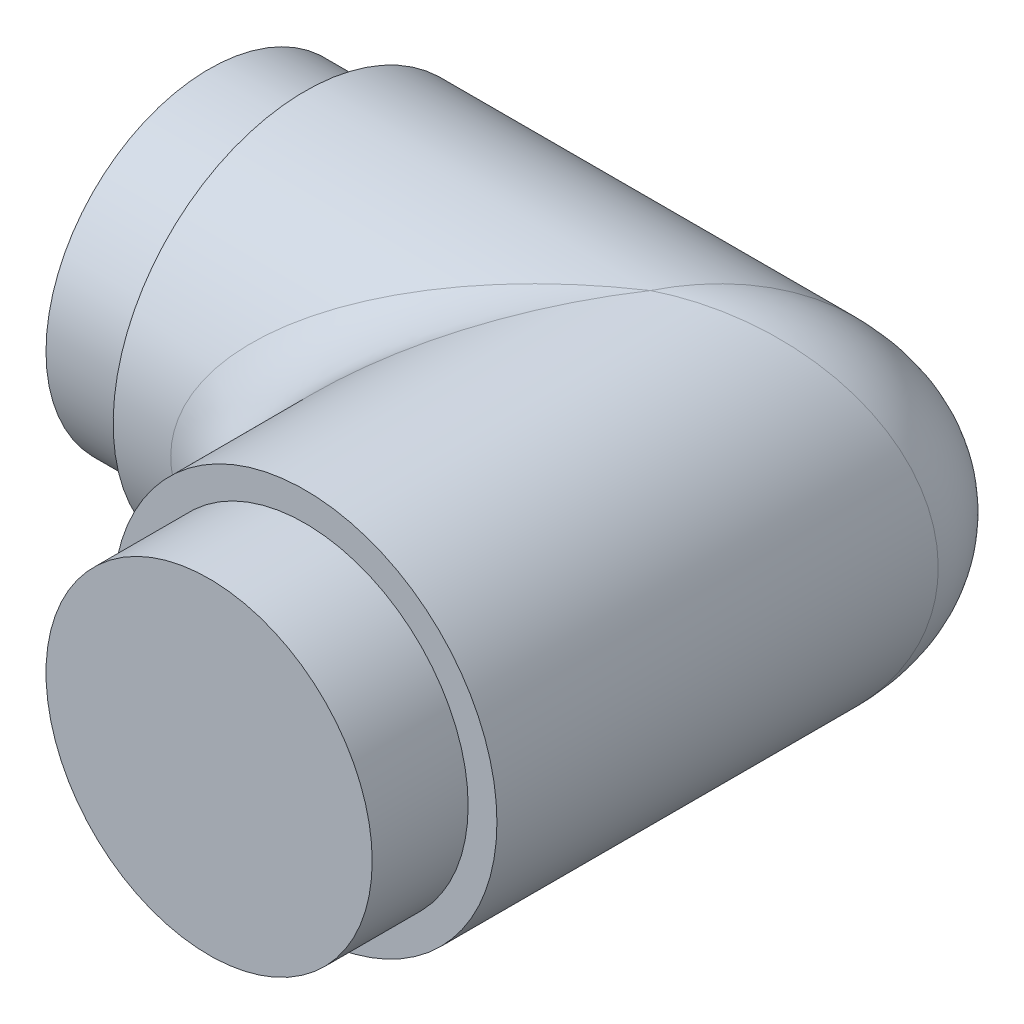
ISO-10303-21;
HEADER;
FILE_DESCRIPTION(('STEP AP214'),'2;1');
FILE_NAME('part.step','',(''),(''),'','','');
FILE_SCHEMA(('AUTOMOTIVE_DESIGN { 1 0 10303 214 1 1 1 1 }'));
ENDSEC;
DATA;
#1=APPLICATION_CONTEXT('core data for automotive mechanical design processes');
#2=APPLICATION_PROTOCOL_DEFINITION('international standard','automotive_design',2000,#1);
#3=PRODUCT_CONTEXT('',#1,'mechanical');
#4=PRODUCT('Part','Part','',(#3));
#5=PRODUCT_RELATED_PRODUCT_CATEGORY('part','',(#4));
#6=PRODUCT_DEFINITION_FORMATION('','',#4);
#7=PRODUCT_DEFINITION_CONTEXT('part definition',#1,'design');
#8=PRODUCT_DEFINITION('design','',#6,#7);
#9=PRODUCT_DEFINITION_SHAPE('','',#8);
#10=(LENGTH_UNIT() NAMED_UNIT(*) SI_UNIT(.MILLI.,.METRE.));
#11=(NAMED_UNIT(*) PLANE_ANGLE_UNIT() SI_UNIT($,.RADIAN.));
#12=(NAMED_UNIT(*) SI_UNIT($,.STERADIAN.) SOLID_ANGLE_UNIT());
#13=UNCERTAINTY_MEASURE_WITH_UNIT(LENGTH_MEASURE(1.E-05),#10,'distance_accuracy_value','');
#14=(GEOMETRIC_REPRESENTATION_CONTEXT(3) GLOBAL_UNCERTAINTY_ASSIGNED_CONTEXT((#13)) GLOBAL_UNIT_ASSIGNED_CONTEXT((#10,
#11,#12)) REPRESENTATION_CONTEXT('',''));
#15=CARTESIAN_POINT('',(0.,0.,0.));
#16=DIRECTION('',(0.,0.,1.));
#17=DIRECTION('',(1.,0.,0.));
#18=AXIS2_PLACEMENT_3D('',#15,#16,#17);
#19=CARTESIAN_POINT('',(-36.,0.,-36.));
#20=DIRECTION('',(1.,0.,0.));
#21=DIRECTION('',(0.,0.,-1.));
#22=AXIS2_PLACEMENT_3D('',#19,#20,#21);
#23=PLANE('',#22);
#24=CARTESIAN_POINT('',(-36.,0.,-36.));
#25=DIRECTION('',(-1.,0.,0.));
#26=DIRECTION('',(0.,0.,1.));
#27=AXIS2_PLACEMENT_3D('',#24,#25,#26);
#28=CIRCLE('',#27,17.);
#29=CARTESIAN_POINT('',(-36.,0.,-19.));
#30=VERTEX_POINT('',#29);
#31=EDGE_CURVE('E11',#30,#30,#28,.T.);
#32=ORIENTED_EDGE('',*,*,#31,.F.);
#33=EDGE_LOOP('',(#32));
#34=FACE_BOUND('',#33,.T.);
#35=CARTESIAN_POINT('',(-36.,0.,-36.));
#36=DIRECTION('',(1.,0.,0.));
#37=DIRECTION('',(0.,0.,-1.));
#38=AXIS2_PLACEMENT_3D('',#35,#36,#37);
#39=CIRCLE('',#38,20.);
#40=CARTESIAN_POINT('',(-36.,0.,-56.));
#41=VERTEX_POINT('',#40);
#42=EDGE_CURVE('E112',#41,#41,#39,.T.);
#43=ORIENTED_EDGE('',*,*,#42,.F.);
#44=EDGE_LOOP('',(#43));
#45=FACE_BOUND('',#44,.T.);
#46=ADVANCED_FACE('F35',(#34,#45),#23,.F.);
#47=CARTESIAN_POINT('',(0.,0.,0.));
#48=DIRECTION('',(0.,0.,1.));
#49=DIRECTION('',(1.,0.,0.));
#50=AXIS2_PLACEMENT_3D('',#47,#48,#49);
#51=PLANE('',#50);
#52=CARTESIAN_POINT('',(0.,0.,0.));
#53=DIRECTION('',(0.,0.,1.));
#54=DIRECTION('',(1.,0.,0.));
#55=AXIS2_PLACEMENT_3D('',#52,#53,#54);
#56=CIRCLE('',#55,17.);
#57=CARTESIAN_POINT('',(17.,0.,0.));
#58=VERTEX_POINT('',#57);
#59=EDGE_CURVE('E48',#58,#58,#56,.T.);
#60=ORIENTED_EDGE('',*,*,#59,.F.);
#61=EDGE_LOOP('',(#60));
#62=FACE_BOUND('',#61,.T.);
#63=CARTESIAN_POINT('',(0.,0.,0.));
#64=DIRECTION('',(0.,0.,1.));
#65=DIRECTION('',(1.,0.,0.));
#66=AXIS2_PLACEMENT_3D('',#63,#64,#65);
#67=CIRCLE('',#66,20.);
#68=CARTESIAN_POINT('',(20.,0.,0.));
#69=VERTEX_POINT('',#68);
#70=EDGE_CURVE('E72',#69,#69,#67,.T.);
#71=ORIENTED_EDGE('',*,*,#70,.T.);
#72=EDGE_LOOP('',(#71));
#73=FACE_BOUND('',#72,.T.);
#74=ADVANCED_FACE('F122',(#62,#73),#51,.T.);
#75=CARTESIAN_POINT('',(22.1,0.,-36.));
#76=DIRECTION('',(-1.,0.,0.));
#77=DIRECTION('',(0.,0.,1.));
#78=AXIS2_PLACEMENT_3D('',#75,#76,#77);
#79=CYLINDRICAL_SURFACE('',#78,20.);
#80=CARTESIAN_POINT('',(0.,0.,-36.));
#81=DIRECTION('',(0.894427190999916,0.,0.447213595499958));
#82=DIRECTION('',(-0.447213595499958,0.,0.894427190999916));
#83=AXIS2_PLACEMENT_3D('',#80,#81,#82);
#84=ELLIPSE('',#83,22.3606797749979,20.);
#85=CARTESIAN_POINT('',(0.,20.,-36.));
#86=VERTEX_POINT('',#85);
#87=CARTESIAN_POINT('',(0.,-20.,-36.));
#88=VERTEX_POINT('',#87);
#89=EDGE_CURVE('E62',#86,#88,#84,.F.);
#90=ORIENTED_EDGE('',*,*,#89,.T.);
#91=CARTESIAN_POINT('',(0.,0.,-36.));
#92=DIRECTION('',(0.554700196225229,0.,0.832050294337843));
#93=DIRECTION('',(-0.832050294337844,0.,0.554700196225229));
#94=AXIS2_PLACEMENT_3D('',#91,#92,#93);
#95=ELLIPSE('',#94,36.0555127546399,20.);
#96=EDGE_CURVE('E67',#88,#86,#95,.F.);
#97=ORIENTED_EDGE('',*,*,#96,.T.);
#98=EDGE_LOOP('',(#90,#97));
#99=FACE_BOUND('',#98,.T.);
#100=ORIENTED_EDGE('',*,*,#42,.T.);
#101=EDGE_LOOP('',(#100));
#102=FACE_BOUND('',#101,.T.);
#103=ADVANCED_FACE('F70',(#99,#102),#79,.T.);
#104=CARTESIAN_POINT('',(0.,0.,0.));
#105=DIRECTION('',(0.,0.,-1.));
#106=DIRECTION('',(-1.,0.,0.));
#107=AXIS2_PLACEMENT_3D('',#104,#105,#106);
#108=CYLINDRICAL_SURFACE('',#107,20.);
#109=ORIENTED_EDGE('',*,*,#70,.F.);
#110=EDGE_LOOP('',(#109));
#111=FACE_BOUND('',#110,.T.);
#112=CARTESIAN_POINT('',(0.,0.,-36.));
#113=DIRECTION('',(0.832050294337843,0.,0.554700196225229));
#114=DIRECTION('',(-0.554700196225229,0.,0.832050294337844));
#115=AXIS2_PLACEMENT_3D('',#112,#113,#114);
#116=ELLIPSE('',#115,36.0555127546399,20.);
#117=EDGE_CURVE('E55',#86,#88,#116,.T.);
#118=ORIENTED_EDGE('',*,*,#117,.T.);
#119=CARTESIAN_POINT('',(0.,0.,-36.));
#120=DIRECTION('',(0.447213595499958,0.,0.894427190999916));
#121=DIRECTION('',(-0.894427190999916,0.,0.447213595499958));
#122=AXIS2_PLACEMENT_3D('',#119,#120,#121);
#123=ELLIPSE('',#122,22.3606797749979,20.);
#124=EDGE_CURVE('E60',#88,#86,#123,.T.);
#125=ORIENTED_EDGE('',*,*,#124,.T.);
#126=EDGE_LOOP('',(#118,#125));
#127=FACE_BOUND('',#126,.T.);
#128=ADVANCED_FACE('F66',(#111,#127),#108,.T.);
#129=CARTESIAN_POINT('',(0.,-20.,-36.));
#130=CARTESIAN_POINT('',(0.,-20.,-36.));
#131=CARTESIAN_POINT('',(0.,-20.,-36.));
#132=CARTESIAN_POINT('',(-0.653537407305081,-19.9999773718841,-35.56430839513));
#133=CARTESIAN_POINT('',(-0.544619600287355,-20.0000955009884,-35.4553803997127));
#134=CARTESIAN_POINT('',(-0.435691604869956,-19.9999773718841,-35.3464625926949));
#135=CARTESIAN_POINT('',(-1.30707757604467,-19.9857617711192,-35.1286149493036));
#136=CARTESIAN_POINT('',(-1.08961987010995,-19.9786387208549,-34.9103801298901));
#137=CARTESIAN_POINT('',(-0.871385050696371,-19.9857617711192,-34.6929224239553));
#138=CARTESIAN_POINT('',(-2.61280923014607,-19.9287829881958,-34.2581271799026));
#139=CARTESIAN_POINT('',(-2.17632947258684,-19.8931632573161,-33.8236705274132));
#140=CARTESIAN_POINT('',(-1.74187282009737,-19.9287829881958,-33.3871907698539));
#141=CARTESIAN_POINT('',(-3.26500059844789,-19.886017424601,-33.823332934368));
#142=CARTESIAN_POINT('',(-2.71880862854572,-19.8290193154072,-33.2811913714543));
#143=CARTESIAN_POINT('',(-2.17666706563197,-19.886017424601,-32.7349994015521));
#144=CARTESIAN_POINT('',(-4.5610256459674,-19.7722637470195,-32.9593162360218));
#145=CARTESIAN_POINT('',(-3.79321706520929,-19.6588965795598,-32.2067829347907));
#146=CARTESIAN_POINT('',(-3.04068376397822,-19.7722637470195,-31.4389743540326));
#147=CARTESIAN_POINT('',(-5.20488318732619,-19.7015192201858,-32.530077875116));
#148=CARTESIAN_POINT('',(-4.32594777614854,-19.5530381385259,-31.6740522238515));
#149=CARTESIAN_POINT('',(-3.46992212488395,-19.7015192201858,-30.7951168126738));
#150=CARTESIAN_POINT('',(-6.488276663152,-19.5315168178226,-31.6744822245655));
#151=CARTESIAN_POINT('',(-5.38287178911451,-19.2997253684728,-30.6171282108855));
#152=CARTESIAN_POINT('',(-4.32551777543447,-19.5315168178226,-29.511723336848));
#153=CARTESIAN_POINT('',(-7.12781269379289,-19.4322595789879,-31.2481248708048));
#154=CARTESIAN_POINT('',(-5.90777086529949,-19.1519165725116,-30.0922291347005));
#155=CARTESIAN_POINT('',(-4.75187512919519,-19.4322595789879,-28.8721873062071));
#156=CARTESIAN_POINT('',(-9.01639353009967,-19.0949057834528,-29.9890709799334));
#157=CARTESIAN_POINT('',(-7.45233483334029,-18.6504370155069,-28.5476651666597));
#158=CARTESIAN_POINT('',(-6.0109290200666,-19.0949057834528,-26.9836064699003));
#159=CARTESIAN_POINT('',(-10.2574815112588,-18.8153091650284,-29.161678992494));
#160=CARTESIAN_POINT('',(-8.45566627181197,-18.2357073054076,-27.544333728188));
#161=CARTESIAN_POINT('',(-6.83832100750598,-18.8153091650284,-25.7425184887412));
#162=CARTESIAN_POINT('',(-12.6733960383033,-18.1481916263322,-27.5510693077979));
#163=CARTESIAN_POINT('',(-10.3681981398418,-17.2636289238417,-25.6318018601581));
#164=CARTESIAN_POINT('',(-8.44893069220206,-18.1481916263322,-23.3266039616967));
#165=CARTESIAN_POINT('',(-13.8491017360705,-17.7634990299673,-26.7672655092867));
#166=CARTESIAN_POINT('',(-11.2832995131976,-16.7048543488466,-24.7167004868023));
#167=CARTESIAN_POINT('',(-9.2327344907133,-17.7634990299673,-22.1508982639295));
#168=CARTESIAN_POINT('',(-16.114265096962,-16.8916175524403,-25.2571566020249));
#169=CARTESIAN_POINT('',(-12.9932023530867,-15.4684647846325,-23.0067976469133));
#170=CARTESIAN_POINT('',(-10.7428433979751,-16.8916175524403,-19.8857349030379));
#171=CARTESIAN_POINT('',(-17.2052768708399,-16.4080808872042,-24.5298154194387));
#172=CARTESIAN_POINT('',(-13.7935550156403,-14.789032809453,-22.2064449843596));
#173=CARTESIAN_POINT('',(-11.4701845805613,-16.4080808872042,-18.7947231291601));
#174=CARTESIAN_POINT('',(-18.7717447687386,-15.606730246908,-23.4855034875083));
#175=CARTESIAN_POINT('',(-14.886500507668,-13.706290360695,-21.113499492332));
#176=CARTESIAN_POINT('',(-12.5144965124917,-15.606730246908,-17.2282552312614));
#177=CARTESIAN_POINT('',(-19.2729021484031,-15.3330845349561,-23.1513985677331));
#178=CARTESIAN_POINT('',(-15.23069139662,-13.338025024348,-20.76930860338));
#179=CARTESIAN_POINT('',(-12.8486014322669,-15.3330845349561,-16.7270978515969));
#180=CARTESIAN_POINT('',(-20.2572013011531,-14.7584123910426,-22.4951991325665));
#181=CARTESIAN_POINT('',(-15.8893754261638,-12.5776764494615,-20.1106245738362));
#182=CARTESIAN_POINT('',(-13.5048008674334,-14.7584123910426,-15.7427986988469));
#183=CARTESIAN_POINT('',(-20.7403421396597,-14.457384541455,-22.1731052402277));
#184=CARTESIAN_POINT('',(-16.2037211792948,-12.1849468758514,-19.7962788207051));
#185=CARTESIAN_POINT('',(-13.8268947597722,-14.457384541455,-15.2596578603403));
#186=CARTESIAN_POINT('',(-22.1182170964308,-13.5387777689962,-21.2545219357111));
#187=CARTESIAN_POINT('',(-17.077019299719,-11.003056666434,-18.922980700281));
#188=CARTESIAN_POINT('',(-14.7454780642888,-13.5387777689962,-13.8817829035692));
#189=CARTESIAN_POINT('',(-22.9855762886943,-12.8833274442366,-20.6762824742014));
#190=CARTESIAN_POINT('',(-17.5839966386471,-10.1917707040173,-18.4160033613529));
#191=CARTESIAN_POINT('',(-15.3237175257986,-12.8833274442366,-13.0144237113057));
#192=CARTESIAN_POINT('',(-24.1900266706173,-11.836891963896,-19.8733155529229));
#193=CARTESIAN_POINT('',(-18.2215819851318,-8.98251628311905,-17.7784180148682));
#194=CARTESIAN_POINT('',(-16.1266844470771,-11.836891963896,-11.8099733293826));
#195=CARTESIAN_POINT('',(-24.5675048716504,-11.4865355671881,-19.6216634189027));
#196=CARTESIAN_POINT('',(-18.4122643609386,-8.58494781495033,-17.5877356390614));
#197=CARTESIAN_POINT('',(-16.3783365810973,-11.4865355671881,-11.4324951283496));
#198=CARTESIAN_POINT('',(-25.2954228650667,-10.7614449903105,-19.1363847566237));
#199=CARTESIAN_POINT('',(-18.7593462186233,-7.78937698727998,-17.2406537813767));
#200=CARTESIAN_POINT('',(-16.8636152433763,-10.7614449903105,-10.7045771349332));
#201=CARTESIAN_POINT('',(-25.6458609848502,-10.3867093047661,-18.9027593434315));
#202=CARTESIAN_POINT('',(-18.9151869433859,-7.39141442488322,-17.0848130566141));
#203=CARTESIAN_POINT('',(-17.0972406565685,-10.3867093047661,-10.3541390151498));
#204=CARTESIAN_POINT('',(-26.3009735469405,-9.63025284125466,-18.4660176353746));
#205=CARTESIAN_POINT('',(-19.1859072414716,-6.62004998263711,-16.8140927585284));
#206=CARTESIAN_POINT('',(-17.5339823646254,-9.63025284125466,-9.69902645305947));
#207=CARTESIAN_POINT('',(-26.606981088266,-9.24955941922355,-18.2620126078303));
#208=CARTESIAN_POINT('',(-19.3018233823111,-6.24635398283334,-16.6981766176889));
#209=CARTESIAN_POINT('',(-17.7379873921697,-9.24955941922355,-9.39301891173396));
#210=CARTESIAN_POINT('',(-27.1867791985308,-8.46711639645048,-17.8754805343203));
#211=CARTESIAN_POINT('',(-19.5029046512452,-5.51224033756709,-16.4970953487547));
#212=CARTESIAN_POINT('',(-18.1245194656797,-8.46711639645048,-8.8132208014692));
#213=CARTESIAN_POINT('',(-27.4605840336142,-8.06537623452368,-17.6929439775918));
#214=CARTESIAN_POINT('',(-19.5875499962666,-5.15231091872614,-16.4124500037334));
#215=CARTESIAN_POINT('',(-18.3070560224082,-8.06537623452369,-8.53941596638581));
#216=CARTESIAN_POINT('',(-27.962209749421,-7.25802070097671,-17.3585268337181));
#217=CARTESIAN_POINT('',(-19.7261277201694,-4.46574375605141,-16.2738722798305));
#218=CARTESIAN_POINT('',(-18.6414731662819,-7.25802070097671,-8.03779025057902));
#219=CARTESIAN_POINT('',(-28.1914077293382,-6.85316776976346,-17.2057281804433));
#220=CARTESIAN_POINT('',(-19.7807305467133,-4.1388308799805,-16.2192694532867));
#221=CARTESIAN_POINT('',(-18.7942718195567,-6.85316776976346,-7.80859227066178));
#222=CARTESIAN_POINT('',(-28.6130221347867,-6.02673471134899,-16.9246519101449));
#223=CARTESIAN_POINT('',(-19.8681955506459,-3.50728084108286,-16.1318044493541));
#224=CARTESIAN_POINT('',(-19.0753480898551,-6.02673471134899,-7.38697786521331));
#225=CARTESIAN_POINT('',(-28.8054405641676,-5.60515549695312,-16.7963729572214));
#226=CARTESIAN_POINT('',(-19.9007223528833,-3.2034297548191,-16.0992776471167));
#227=CARTESIAN_POINT('',(-19.2036270427786,-5.60515549695312,-7.19455943583244));
#228=CARTESIAN_POINT('',(-29.1449617876775,-4.76041281458725,-16.5700254748818));
#229=CARTESIAN_POINT('',(-19.9486789739317,-2.62868507619281,-16.0513210260683));
#230=CARTESIAN_POINT('',(-19.4299745251182,-4.76041281458725,-6.85503821232245));
#231=CARTESIAN_POINT('',(-29.2932464027904,-4.33767274658362,-16.4711690648097));
#232=CARTESIAN_POINT('',(-19.9643907766892,-2.35779435351466,-16.0356092233108));
#233=CARTESIAN_POINT('',(-19.5288309351903,-4.33767274658362,-6.70675359720958));
#234=CARTESIAN_POINT('',(-29.549257872628,-3.48138347973537,-16.3004947515849));
#235=CARTESIAN_POINT('',(-19.9859253927544,-1.83741425520838,-16.0140746072456));
#236=CARTESIAN_POINT('',(-19.6995052484151,-3.48138347973537,-6.45074212737195));
#237=CARTESIAN_POINT('',(-29.6569865448623,-3.0478347662075,-16.2286756367592));
#238=CARTESIAN_POINT('',(-19.9916428179296,-1.58871449621811,-16.0083571820704));
#239=CARTESIAN_POINT('',(-19.7713243632408,-3.0478347662075,-6.34301345513767));
#240=CARTESIAN_POINT('',(-29.8282967068132,-2.18034501117055,-16.1144688621238));
#241=CARTESIAN_POINT('',(-19.9982830029063,-1.11186402750622,-16.0017169970937));
#242=CARTESIAN_POINT('',(-19.8855311378762,-2.18034501117055,-6.17170329318681));
#243=CARTESIAN_POINT('',(-29.8925695374654,-1.74652568442777,-16.0716203083569));
#244=CARTESIAN_POINT('',(-19.99924835984,-0.884135657345921,-16.00075164016));
#245=CARTESIAN_POINT('',(-19.9283796916431,-1.74652568442777,-6.10743046253455));
#246=CARTESIAN_POINT('',(-29.97842080437,-0.875137527237295,-16.0143861304209));
#247=CARTESIAN_POINT('',(-20.0001089790586,-0.43727438010679,-15.9998910209414));
#248=CARTESIAN_POINT('',(-19.9856138695791,-0.875137527237295,-6.02157919563003));
#249=CARTESIAN_POINT('',(-30.,-0.437568763618647,-16.));
#250=CARTESIAN_POINT('',(-20.,-0.218794797614534,-16.));
#251=CARTESIAN_POINT('',(-20.,-0.437568763618647,-5.99999999999999));
#252=CARTESIAN_POINT('',(-30.,0.437568763618647,-16.));
#253=CARTESIAN_POINT('',(-20.,0.218794797614534,-16.));
#254=CARTESIAN_POINT('',(-20.,0.437568763618647,-5.99999999999999));
#255=CARTESIAN_POINT('',(-29.97842080437,0.875137527237294,-16.0143861304209));
#256=CARTESIAN_POINT('',(-20.0001089790586,0.437274380106789,-15.9998910209414));
#257=CARTESIAN_POINT('',(-19.9856138695791,0.875137527237295,-6.02157919563003));
#258=CARTESIAN_POINT('',(-29.8925695374654,1.74652568442777,-16.0716203083569));
#259=CARTESIAN_POINT('',(-19.99924835984,0.88413565734592,-16.00075164016));
#260=CARTESIAN_POINT('',(-19.9283796916431,1.74652568442777,-6.10743046253455));
#261=CARTESIAN_POINT('',(-29.8282967068132,2.18034501117055,-16.1144688621238));
#262=CARTESIAN_POINT('',(-19.9982830029063,1.11186402750622,-16.0017169970937));
#263=CARTESIAN_POINT('',(-19.8855311378762,2.18034501117055,-6.17170329318681));
#264=CARTESIAN_POINT('',(-29.6569865448623,3.0478347662075,-16.2286756367592));
#265=CARTESIAN_POINT('',(-19.9916428179296,1.58871449621811,-16.0083571820704));
#266=CARTESIAN_POINT('',(-19.7713243632408,3.04783476620749,-6.34301345513767));
#267=CARTESIAN_POINT('',(-29.549257872628,3.48138347973536,-16.3004947515849));
#268=CARTESIAN_POINT('',(-19.9859253927544,1.83741425520838,-16.0140746072456));
#269=CARTESIAN_POINT('',(-19.6995052484151,3.48138347973536,-6.45074212737195));
#270=CARTESIAN_POINT('',(-29.2932464027904,4.33767274658361,-16.4711690648097));
#271=CARTESIAN_POINT('',(-19.9643907766892,2.35779435351465,-16.0356092233108));
#272=CARTESIAN_POINT('',(-19.5288309351903,4.33767274658361,-6.70675359720957));
#273=CARTESIAN_POINT('',(-29.1449617876775,4.76041281458724,-16.5700254748818));
#274=CARTESIAN_POINT('',(-19.9486789739317,2.6286850761928,-16.0513210260683));
#275=CARTESIAN_POINT('',(-19.4299745251182,4.76041281458724,-6.85503821232245));
#276=CARTESIAN_POINT('',(-28.8054405641676,5.6051554969531,-16.7963729572214));
#277=CARTESIAN_POINT('',(-19.9007223528833,3.20342975481909,-16.0992776471167));
#278=CARTESIAN_POINT('',(-19.2036270427786,5.6051554969531,-7.19455943583243));
#279=CARTESIAN_POINT('',(-28.6130221347867,6.02673471134898,-16.9246519101449));
#280=CARTESIAN_POINT('',(-19.8681955506459,3.50728084108285,-16.1318044493541));
#281=CARTESIAN_POINT('',(-19.0753480898551,6.02673471134898,-7.3869778652133));
#282=CARTESIAN_POINT('',(-28.1914077293382,6.85316776976346,-17.2057281804433));
#283=CARTESIAN_POINT('',(-19.7807305467133,4.13883087998049,-16.2192694532867));
#284=CARTESIAN_POINT('',(-18.7942718195567,6.85316776976346,-7.80859227066177));
#285=CARTESIAN_POINT('',(-27.962209749421,7.25802070097671,-17.3585268337181));
#286=CARTESIAN_POINT('',(-19.7261277201695,4.4657437560514,-16.2738722798305));
#287=CARTESIAN_POINT('',(-18.6414731662819,7.25802070097671,-8.03779025057902));
#288=CARTESIAN_POINT('',(-27.4605840336142,8.06537623452369,-17.6929439775918));
#289=CARTESIAN_POINT('',(-19.5875499962666,5.15231091872614,-16.4124500037334));
#290=CARTESIAN_POINT('',(-18.3070560224082,8.06537623452369,-8.53941596638581));
#291=CARTESIAN_POINT('',(-27.1867791985308,8.46711639645048,-17.8754805343203));
#292=CARTESIAN_POINT('',(-19.5029046512452,5.51224033756709,-16.4970953487548));
#293=CARTESIAN_POINT('',(-18.1245194656797,8.46711639645047,-8.81322080146921));
#294=CARTESIAN_POINT('',(-26.606981088266,9.24955941922354,-18.2620126078303));
#295=CARTESIAN_POINT('',(-19.3018233823111,6.24635398283333,-16.6981766176889));
#296=CARTESIAN_POINT('',(-17.7379873921697,9.24955941922354,-9.39301891173396));
#297=CARTESIAN_POINT('',(-26.3009735469405,9.63025284125465,-18.4660176353746));
#298=CARTESIAN_POINT('',(-19.1859072414716,6.6200499826371,-16.8140927585284));
#299=CARTESIAN_POINT('',(-17.5339823646254,9.63025284125465,-9.69902645305946));
#300=CARTESIAN_POINT('',(-25.6458609848502,10.3867093047661,-18.9027593434315));
#301=CARTESIAN_POINT('',(-18.9151869433859,7.39141442488321,-17.0848130566141));
#302=CARTESIAN_POINT('',(-17.0972406565685,10.3867093047661,-10.3541390151498));
#303=CARTESIAN_POINT('',(-25.2954228650668,10.7614449903105,-19.1363847566237));
#304=CARTESIAN_POINT('',(-18.7593462186233,7.78937698727997,-17.2406537813767));
#305=CARTESIAN_POINT('',(-16.8636152433763,10.7614449903105,-10.7045771349332));
#306=CARTESIAN_POINT('',(-24.5675048716504,11.4865355671881,-19.6216634189027));
#307=CARTESIAN_POINT('',(-18.4122643609386,8.58494781495033,-17.5877356390614));
#308=CARTESIAN_POINT('',(-16.3783365810973,11.4865355671881,-11.4324951283496));
#309=CARTESIAN_POINT('',(-24.1900266706174,11.836891963896,-19.8733155529229));
#310=CARTESIAN_POINT('',(-18.2215819851318,8.98251628311905,-17.7784180148682));
#311=CARTESIAN_POINT('',(-16.1266844470771,11.836891963896,-11.8099733293826));
#312=CARTESIAN_POINT('',(-22.9855762886943,12.8833274442366,-20.6762824742014));
#313=CARTESIAN_POINT('',(-17.5839966386471,10.1917707040173,-18.4160033613529));
#314=CARTESIAN_POINT('',(-15.3237175257986,12.8833274442366,-13.0144237113057));
#315=CARTESIAN_POINT('',(-22.1182170964308,13.5387777689962,-21.2545219357111));
#316=CARTESIAN_POINT('',(-17.077019299719,11.003056666434,-18.922980700281));
#317=CARTESIAN_POINT('',(-14.7454780642889,13.5387777689962,-13.8817829035692));
#318=CARTESIAN_POINT('',(-20.7403421396597,14.457384541455,-22.1731052402277));
#319=CARTESIAN_POINT('',(-16.2037211792948,12.1849468758514,-19.7962788207051));
#320=CARTESIAN_POINT('',(-13.8268947597723,14.457384541455,-15.2596578603403));
#321=CARTESIAN_POINT('',(-20.2572013011531,14.7584123910426,-22.4951991325665));
#322=CARTESIAN_POINT('',(-15.8893754261638,12.5776764494614,-20.1106245738362));
#323=CARTESIAN_POINT('',(-13.5048008674335,14.7584123910426,-15.7427986988469));
#324=CARTESIAN_POINT('',(-19.2729021484031,15.3330845349561,-23.1513985677331));
#325=CARTESIAN_POINT('',(-15.23069139662,13.338025024348,-20.76930860338));
#326=CARTESIAN_POINT('',(-12.8486014322669,15.3330845349561,-16.7270978515969));
#327=CARTESIAN_POINT('',(-18.7717447687386,15.6067302469079,-23.4855034875082));
#328=CARTESIAN_POINT('',(-14.886500507668,13.706290360695,-21.113499492332));
#329=CARTESIAN_POINT('',(-12.5144965124917,15.6067302469079,-17.2282552312614));
#330=CARTESIAN_POINT('',(-17.2052768708399,16.4080808872042,-24.5298154194387));
#331=CARTESIAN_POINT('',(-13.7935550156404,14.789032809453,-22.2064449843596));
#332=CARTESIAN_POINT('',(-11.4701845805613,16.4080808872042,-18.7947231291601));
#333=CARTESIAN_POINT('',(-16.1142650969621,16.8916175524403,-25.2571566020249));
#334=CARTESIAN_POINT('',(-12.9932023530867,15.4684647846325,-23.0067976469133));
#335=CARTESIAN_POINT('',(-10.7428433979751,16.8916175524403,-19.8857349030379));
#336=CARTESIAN_POINT('',(-13.8491017360705,17.7634990299673,-26.7672655092867));
#337=CARTESIAN_POINT('',(-11.2832995131976,16.7048543488466,-24.7167004868023));
#338=CARTESIAN_POINT('',(-9.2327344907133,17.7634990299673,-22.1508982639295));
#339=CARTESIAN_POINT('',(-12.6733960383033,18.1481916263322,-27.5510693077979));
#340=CARTESIAN_POINT('',(-10.3681981398419,17.2636289238417,-25.6318018601581));
#341=CARTESIAN_POINT('',(-8.44893069220206,18.1481916263322,-23.3266039616967));
#342=CARTESIAN_POINT('',(-10.2574815112588,18.8153091650284,-29.161678992494));
#343=CARTESIAN_POINT('',(-8.45566627181198,18.2357073054076,-27.544333728188));
#344=CARTESIAN_POINT('',(-6.83832100750599,18.8153091650284,-25.7425184887412));
#345=CARTESIAN_POINT('',(-9.01639353009969,19.0949057834528,-29.9890709799334));
#346=CARTESIAN_POINT('',(-7.4523348333403,18.6504370155069,-28.5476651666597));
#347=CARTESIAN_POINT('',(-6.01092902006661,19.0949057834528,-26.9836064699003));
#348=CARTESIAN_POINT('',(-7.1278126937929,19.4322595789879,-31.2481248708048));
#349=CARTESIAN_POINT('',(-5.9077708652995,19.1519165725116,-30.0922291347005));
#350=CARTESIAN_POINT('',(-4.7518751291952,19.4322595789879,-28.8721873062071));
#351=CARTESIAN_POINT('',(-6.48827666315201,19.5315168178226,-31.6744822245655));
#352=CARTESIAN_POINT('',(-5.38287178911452,19.2997253684728,-30.6171282108855));
#353=CARTESIAN_POINT('',(-4.32551777543448,19.5315168178226,-29.511723336848));
#354=CARTESIAN_POINT('',(-5.2048831873262,19.7015192201858,-32.530077875116));
#355=CARTESIAN_POINT('',(-4.32594777614855,19.5530381385259,-31.6740522238514));
#356=CARTESIAN_POINT('',(-3.46992212488396,19.7015192201858,-30.7951168126738));
#357=CARTESIAN_POINT('',(-4.56102564596741,19.7722637470195,-32.9593162360218));
#358=CARTESIAN_POINT('',(-3.7932170652093,19.6588965795598,-32.2067829347907));
#359=CARTESIAN_POINT('',(-3.04068376397823,19.7722637470195,-31.4389743540326));
#360=CARTESIAN_POINT('',(-3.2650005984479,19.886017424601,-33.823332934368));
#361=CARTESIAN_POINT('',(-2.71880862854573,19.8290193154072,-33.2811913714543));
#362=CARTESIAN_POINT('',(-2.17666706563198,19.886017424601,-32.7349994015521));
#363=CARTESIAN_POINT('',(-2.61280923014608,19.9287829881958,-34.2581271799026));
#364=CARTESIAN_POINT('',(-2.17632947258685,19.8931632573161,-33.8236705274131));
#365=CARTESIAN_POINT('',(-1.74187282009738,19.9287829881958,-33.3871907698539));
#366=CARTESIAN_POINT('',(-1.30707757604468,19.9857617711192,-35.1286149493036));
#367=CARTESIAN_POINT('',(-1.08961987010996,19.9786387208549,-34.91038012989));
#368=CARTESIAN_POINT('',(-0.871385050696379,19.9857617711192,-34.6929224239553));
#369=CARTESIAN_POINT('',(-0.65353740730509,19.999977371884,-35.56430839513));
#370=CARTESIAN_POINT('',(-0.544619600287364,20.0000955009884,-35.4553803997126));
#371=CARTESIAN_POINT('',(-0.435691604869961,19.999977371884,-35.3464625926949));
#372=CARTESIAN_POINT('',(0.,20.,-36.));
#373=CARTESIAN_POINT('',(0.,20.,-36.));
#374=CARTESIAN_POINT('',(0.,20.,-36.));
#375=(BOUNDED_SURFACE() B_SPLINE_SURFACE(3,2,((#129,#130,#131),(#132,#133,#134),(#135,#136,
#137),(#138,#139,#140),(#141,#142,#143),(#144,#145,#146),(#147,#148,#149),(#150,#151,#152),
(#153,#154,#155),(#156,#157,#158),(#159,#160,#161),(#162,#163,#164),(#165,#166,#167),(#168,#169,
#170),(#171,#172,#173),(#174,#175,#176),(#177,#178,#179),(#180,#181,#182),(#183,#184,#185),
(#186,#187,#188),(#189,#190,#191),(#192,#193,#194),(#195,#196,#197),(#198,#199,#200),(#201,#202,
#203),(#204,#205,#206),(#207,#208,#209),(#210,#211,#212),(#213,#214,#215),(#216,#217,#218),
(#219,#220,#221),(#222,#223,#224),(#225,#226,#227),(#228,#229,#230),(#231,#232,#233),(#234,#235,
#236),(#237,#238,#239),(#240,#241,#242),(#243,#244,#245),(#246,#247,#248),(#249,#250,#251),
(#252,#253,#254),(#255,#256,#257),(#258,#259,#260),(#261,#262,#263),(#264,#265,#266),(#267,#268,
#269),(#270,#271,#272),(#273,#274,#275),(#276,#277,#278),(#279,#280,#281),(#282,#283,#284),
(#285,#286,#287),(#288,#289,#290),(#291,#292,#293),(#294,#295,#296),(#297,#298,#299),(#300,#301,
#302),(#303,#304,#305),(#306,#307,#308),(#309,#310,#311),(#312,#313,#314),(#315,#316,#317),
(#318,#319,#320),(#321,#322,#323),(#324,#325,#326),(#327,#328,#329),(#330,#331,#332),(#333,#334,
#335),(#336,#337,#338),(#339,#340,#341),(#342,#343,#344),(#345,#346,#347),(#348,#349,#350),
(#351,#352,#353),(#354,#355,#356),(#357,#358,#359),(#360,#361,#362),(#363,#364,#365),(#366,#367,
#368),(#369,#370,#371),(#372,#373,#374)),.UNSPECIFIED.,.F.,.F.,
.F.) B_SPLINE_SURFACE_WITH_KNOTS((4,2,2,2,2,2,2,2,2,2,2,2,2,2,2,2,2,2,2,2,2,2,2,2,2,2,2,2,2,2,2,
2,2,2,2,2,2,2,2,2,4),(3,3),(0.,2.7724808901635,5.54519306999085,8.29427918930705,
11.0433039257262,16.4476907841848,21.7189438481739,26.8224125825895,29.2782072367125,
31.7341291045062,36.4345409576101,38.6804440683293,40.926485991157,43.0740102662473,
45.2205795526203,47.2834167607679,49.3461415478959,51.3472575068749,53.3482837754128,
55.3166753763072,57.285031965747,59.2533885551867,61.2217801560811,63.222806424619,
65.223922383598,67.2866471707261,69.3494843788736,71.4960536652466,73.6435779403369,
75.8896198631646,78.1355229738838,82.8359348269877,85.2918566947814,87.7476513489044,
92.8511200833201,98.1223731473091,103.526760005768,106.275784742187,109.024870861503,
111.79758304133,114.570063931494),(0.,1.),
.UNSPECIFIED.) GEOMETRIC_REPRESENTATION_ITEM() RATIONAL_B_SPLINE_SURFACE(((1.,1.,1.),(1.,
1.00000025089779,1.),(1.,0.999644067764619,1.),(1.,0.998220693451149,1.),(1.,0.997153442958656,
1.),(1.,0.994321909786397,1.),(1.,0.992563643951486,1.),(1.,0.988355056031836,1.),(1.,
0.985904749400535,1.),(1.,0.977617349084502,1.),(1.,0.970795041511437,1.),(1.,0.954789401423455,
1.),(1.,0.945668371467161,1.),(1.,0.925486708198593,1.),(1.,0.914497053587338,1.),(1.,
0.896889895303255,1.),(1.,0.890962015490834,1.),(1.,0.878747772602456,1.),(1.,0.872461390972461,
1.),(1.,0.85370750765683,1.),(1.,0.840841599033088,1.),(1.,0.821606440505219,1.),(1.,
0.815353008175148,1.),(1.,0.802891657677915,1.),(1.,0.796683742347727,1.),(1.,0.784723279143545,
1.),(1.,0.778962701265357,1.),(1.,0.767759882905943,1.),(1.,0.762317502001514,1.),(1.,
0.752115669076546,1.),(1.,0.747337858779888,1.),(1.,0.738382458066664,1.),(1.,0.734204834953356,
1.),(1.,0.726721604198312,1.),(1.,0.72339367823715,1.),(1.,0.717585867185267,1.),(1.,
0.715105944091858,1.),(1.,0.711136414400891,1.),(1.,0.709631316381887,1.),(1.,0.70761650862688,
1.),(1.,0.707106781186548,1.),(1.,0.707106781186548,1.),(1.,0.70761650862688,1.),(1.,
0.709631316381887,1.),(1.,0.711136414400891,1.),(1.,0.715105944091858,1.),(1.,0.717585867185267,
1.),(1.,0.72339367823715,1.),(1.,0.726721604198312,1.),(1.,0.734204834953356,1.),(1.,
0.738382458066664,1.),(1.,0.747337858779888,1.),(1.,0.752115669076546,1.),(1.,0.762317502001514,
1.),(1.,0.767759882905943,1.),(1.,0.778962701265356,1.),(1.,0.784723279143545,1.),(1.,
0.796683742347727,1.),(1.,0.802891657677914,1.),(1.,0.815353008175148,1.),(1.,0.821606440505219,
1.),(1.,0.840841599033088,1.),(1.,0.85370750765683,1.),(1.,0.872461390972461,1.),(1.,
0.878747772602456,1.),(1.,0.890962015490834,1.),(1.,0.896889895303254,1.),(1.,0.914497053587338,
1.),(1.,0.925486708198593,1.),(1.,0.945668371467161,1.),(1.,0.954789401423455,1.),(1.,
0.970795041511437,1.),(1.,0.977617349084502,1.),(1.,0.985904749400535,1.),(1.,0.988355056031836,
1.),(1.,0.992563643951486,1.),(1.,0.994321909786397,1.),(1.,0.997153442958656,1.),(1.,
0.998220693451149,1.),(1.,0.999644067764619,1.),(1.,1.00000025089779,1.),(1.,1.,1.))) REPRESENTATION_ITEM('') SURFACE());
#376=ORIENTED_EDGE('',*,*,#96,.F.);
#377=ORIENTED_EDGE('',*,*,#117,.F.);
#378=EDGE_LOOP('',(#376,#377));
#379=FACE_BOUND('',#378,.T.);
#380=ADVANCED_FACE('F74',(#379),#375,.F.);
#381=CARTESIAN_POINT('',(0.,20.,-36.));
#382=CARTESIAN_POINT('',(0.,20.,-36.));
#383=CARTESIAN_POINT('',(0.,20.,-36.));
#384=CARTESIAN_POINT('',(0.435691486538856,19.999977458717,-36.2178457432696));
#385=CARTESIAN_POINT('',(0.326771998466629,19.9999882858052,-36.3267719984668));
#386=CARTESIAN_POINT('',(0.217845743269478,19.999977458717,-36.4356914865391));
#387=CARTESIAN_POINT('',(0.871384991528288,19.9857618145375,-36.4356924957643));
#388=CARTESIAN_POINT('',(0.653772051518305,19.9928783224637,-36.6537720515185));
#389=CARTESIAN_POINT('',(0.435692495764182,19.9857618145375,-36.8713849915285));
#390=CARTESIAN_POINT('',(1.7418728792702,19.9287829447739,-36.8709364396352));
#391=CARTESIAN_POINT('',(1.30803469990824,19.9643279776808,-37.3080346999083));
#392=CARTESIAN_POINT('',(0.870936439635101,19.9287829447739,-37.7418728792703));
#393=CARTESIAN_POINT('',(2.17666718398269,19.8860173377536,-37.0883335919913));
#394=CARTESIAN_POINT('',(1.63576416463591,19.9428455853708,-37.6357641646359));
#395=CARTESIAN_POINT('',(1.08833359199132,19.8860173377536,-38.1766671839827));
#396=CARTESIAN_POINT('',(3.04068364663597,19.7722638331268,-37.520341823318));
#397=CARTESIAN_POINT('',(2.28936879141503,19.8854773441529,-38.289368791415));
#398=CARTESIAN_POINT('',(1.52034182331801,19.7722638331268,-39.0406836466359));
#399=CARTESIAN_POINT('',(3.46992171568337,19.7015195204629,-37.7349608578417));
#400=CARTESIAN_POINT('',(2.61570555333056,19.849633763298,-38.6157055533305));
#401=CARTESIAN_POINT('',(1.73496085784177,19.7015195204629,-39.4699217156833));
#402=CARTESIAN_POINT('',(4.32551818462594,19.5315165175523,-38.1627590923131));
#403=CARTESIAN_POINT('',(3.2699902600848,19.7629524657109,-39.2699902600848));
#404=CARTESIAN_POINT('',(2.16275909231307,19.5315165175523,-40.3255181846259));
#405=CARTESIAN_POINT('',(4.75187664860574,19.4322584640234,-38.3759383243029));
#406=CARTESIAN_POINT('',(3.59840441625718,19.7119902216495,-39.5984044162572));
#407=CARTESIAN_POINT('',(2.3759383243029,19.4322584640234,-40.7518766486057));
#408=CARTESIAN_POINT('',(6.01092603301366,19.0949079753935,-39.0054630165068));
#409=CARTESIAN_POINT('',(4.57886446496359,19.5367974730857,-40.5788644649636));
#410=CARTESIAN_POINT('',(3.00546301650677,19.0949079753935,-42.0109260330137));
#411=CARTESIAN_POINT('',(6.83830487020768,18.815321006801,-39.4191524351038));
#412=CARTESIAN_POINT('',(5.23457553486827,19.3892549841169,-41.2345755348683));
#413=CARTESIAN_POINT('',(3.41915243510383,18.815321006801,-42.8383048702077));
#414=CARTESIAN_POINT('',(8.4489464319678,18.1481800762744,-40.2244732159839));
#415=CARTESIAN_POINT('',(6.54283940759103,19.0273195972231,-42.542839407591));
#416=CARTESIAN_POINT('',(4.22447321598391,18.1481800762744,-44.4489464319678));
#417=CARTESIAN_POINT('',(9.23279383259992,17.7634554840703,-40.6163969162999));
#418=CARTESIAN_POINT('',(7.1989247338408,18.8125088138639,-43.1989247338408));
#419=CARTESIAN_POINT('',(4.61639691629994,17.7634554840703,-45.2327938325999));
#420=CARTESIAN_POINT('',(10.7427859449446,16.8916597122685,-41.3713929724723));
#421=CARTESIAN_POINT('',(8.50830456135077,18.3055974456833,-44.5083045613508));
#422=CARTESIAN_POINT('',(5.37139297247231,16.8916597122685,-46.7427859449446));
#423=CARTESIAN_POINT('',(11.4699731796238,16.4082360161356,-41.7349865898119));
#424=CARTESIAN_POINT('',(9.16488993922789,18.0130595640739,-45.1648899392279));
#425=CARTESIAN_POINT('',(5.73498658981195,16.4082360161356,-47.4699731796237));
#426=CARTESIAN_POINT('',(12.853688838193,15.3464585243815,-42.4268444190964));
#427=CARTESIAN_POINT('',(10.4740736204113,17.3342309351491,-46.4740736204112));
#428=CARTESIAN_POINT('',(6.42684441909643,15.3464585243815,-48.853688838193));
#429=CARTESIAN_POINT('',(13.5118521389126,14.77240928453,-42.755926069456));
#430=CARTESIAN_POINT('',(11.1295448172264,16.9476712111358,-47.1295448172264));
#431=CARTESIAN_POINT('',(6.75592606945604,14.77240928453,-49.5118521389126));
#432=CARTESIAN_POINT('',(14.7455676960415,13.5387129569156,-43.372783848021));
#433=CARTESIAN_POINT('',(12.4312674832279,16.0570857399644,-48.4312674832278));
#434=CARTESIAN_POINT('',(7.37278384802102,13.5387129569156,-50.7455676960415));
#435=CARTESIAN_POINT('',(15.323444830753,12.883754384198,-43.6617224153774));
#436=CARTESIAN_POINT('',(13.0797256348181,15.553316357269,-49.0797256348181));
#437=CARTESIAN_POINT('',(7.66172241537745,12.883754384198,-51.323444830753));
#438=CARTESIAN_POINT('',(16.386254032014,11.4985496309357,-44.1931270160061));
#439=CARTESIAN_POINT('',(14.3544419585769,14.3971184497456,-50.3544419585769));
#440=CARTESIAN_POINT('',(8.1931270160061,11.4985496309357,-52.386254032014));
#441=CARTESIAN_POINT('',(16.8741962973297,10.7730107124583,-44.4370981486615));
#442=CARTESIAN_POINT('',(14.9819727409083,13.746069567937,-50.9819727409083));
#443=CARTESIAN_POINT('',(8.43709814866151,10.7730107124583,-52.8741962973297));
#444=CARTESIAN_POINT('',(17.5340157546145,9.63020531609432,-44.7670078773088));
#445=CARTESIAN_POINT('',(15.8852685631319,12.6348762999008,-51.8852685631318));
#446=CARTESIAN_POINT('',(8.76700787730883,9.63020531609432,-53.5340157546145));
#447=CARTESIAN_POINT('',(17.7379963100826,9.24954672751038,-44.8689981550458));
#448=CARTESIAN_POINT('',(16.176939814675,12.2471114356139,-52.176939814675));
#449=CARTESIAN_POINT('',(8.86899815504583,9.24954672751038,-53.7379963100826));
#450=CARTESIAN_POINT('',(18.1245105104626,8.46712916605926,-45.0622552552344));
#451=CARTESIAN_POINT('',(16.7489452180678,11.4163113948345,-52.7489452180678));
#452=CARTESIAN_POINT('',(9.06225525523437,8.46712916605926,-54.1245105104626));
#453=CARTESIAN_POINT('',(18.3070536500568,8.06537964937156,-45.1535268250271));
#454=CARTESIAN_POINT('',(17.0288848865131,10.9728277754013,-53.028884886513));
#455=CARTESIAN_POINT('',(9.15352682502708,8.06537964937156,-54.3070536500568));
#456=CARTESIAN_POINT('',(18.6415107114602,7.25793228156698,-45.3207553557314));
#457=CARTESIAN_POINT('',(17.5590586316413,10.0449331665941,-53.5590586316413));
#458=CARTESIAN_POINT('',(9.32075535573136,7.25793228156699,-54.6415107114602));
#459=CARTESIAN_POINT('',(18.7943382491508,6.85299245690012,-45.3971691245832));
#460=CARTESIAN_POINT('',(17.8096042804528,9.56233911428725,-53.8096042804528));
#461=CARTESIAN_POINT('',(9.39716912458317,6.85299245690012,-54.7943382491508));
#462=CARTESIAN_POINT('',(19.0754027633355,6.02655395413674,-45.5377013816757));
#463=CARTESIAN_POINT('',(18.2843024133027,8.54095091788769,-54.2843024133027));
#464=CARTESIAN_POINT('',(9.53770138167569,6.02655395413673,-55.0754027633355));
#465=CARTESIAN_POINT('',(19.2036516267547,5.6050633998753,-45.601825813379));
#466=CARTESIAN_POINT('',(18.5077611037058,8.00232752731364,-54.5077611037058));
#467=CARTESIAN_POINT('',(9.60182581337897,5.6050633998753,-55.2036516267547));
#468=CARTESIAN_POINT('',(19.4299746651477,4.76041262983373,-45.7149873325722));
#469=CARTESIAN_POINT('',(18.9124034545735,6.88791897046117,-54.9124034545734));
#470=CARTESIAN_POINT('',(9.71498733257226,4.76041262983373,-55.4299746651477));
#471=CARTESIAN_POINT('',(19.5288309726769,4.33767269709021,-45.7644154863396));
#472=CARTESIAN_POINT('',(19.0939532427585,6.31411517670169,-55.0939532427585));
#473=CARTESIAN_POINT('',(9.76441548633964,4.33767269709021,-55.5288309726769));
#474=CARTESIAN_POINT('',(19.6995052109302,3.48138352922655,-45.8497526054674));
#475=CARTESIAN_POINT('',(19.4137787935543,5.12188606353839,-55.4137787935543));
#476=CARTESIAN_POINT('',(9.84975260546735,3.48138352922655,-55.6995052109302));
#477=CARTESIAN_POINT('',(19.7713243533216,3.04783477943086,-45.8856621766613));
#478=CARTESIAN_POINT('',(19.551325999869,4.50451345955081,-55.551325999869));
#479=CARTESIAN_POINT('',(9.88566217666128,3.04783477943086,-55.7713243533216));
#480=CARTESIAN_POINT('',(19.8855311476336,2.18034499816286,-45.9427655738163));
#481=CARTESIAN_POINT('',(19.7730948998854,3.24643868277294,-55.7730948998854));
#482=CARTESIAN_POINT('',(9.94276557381633,2.18034499816286,-55.8855311476336));
#483=CARTESIAN_POINT('',(19.9283796940824,1.74652568071132,-45.9641898470414));
#484=CARTESIAN_POINT('',(19.8575908036873,2.60768456885164,-55.8575908036873));
#485=CARTESIAN_POINT('',(9.96418984704145,1.74652568071132,-55.9283796940824));
#486=CARTESIAN_POINT('',(19.9856138671398,0.875137530953687,-45.9928069335704));
#487=CARTESIAN_POINT('',(19.9712017164623,1.31175420520006,-55.9712017164622));
#488=CARTESIAN_POINT('',(9.99280693357037,0.875137530953687,-55.9856138671398));
#489=CARTESIAN_POINT('',(20.,0.437568765476845,-46.));
#490=CARTESIAN_POINT('',(20.,0.656349900434488,-56.));
#491=CARTESIAN_POINT('',(10.,0.437568765476845,-56.));
#492=CARTESIAN_POINT('',(20.,-0.43756876547684,-46.));
#493=CARTESIAN_POINT('',(20.,-0.656349900434481,-56.));
#494=CARTESIAN_POINT('',(10.,-0.43756876547684,-56.));
#495=CARTESIAN_POINT('',(19.9856138671398,-0.875137530953682,-45.9928069335704));
#496=CARTESIAN_POINT('',(19.9712017164623,-1.31175420520005,-55.9712017164622));
#497=CARTESIAN_POINT('',(9.99280693357037,-0.875137530953682,-55.9856138671398));
#498=CARTESIAN_POINT('',(19.9283796940824,-1.74652568071131,-45.9641898470414));
#499=CARTESIAN_POINT('',(19.8575908036873,-2.60768456885163,-55.8575908036873));
#500=CARTESIAN_POINT('',(9.96418984704145,-1.74652568071131,-55.9283796940824));
#501=CARTESIAN_POINT('',(19.8855311476336,-2.18034499816285,-45.9427655738163));
#502=CARTESIAN_POINT('',(19.7730948998854,-3.24643868277293,-55.7730948998854));
#503=CARTESIAN_POINT('',(9.94276557381633,-2.18034499816285,-55.8855311476336));
#504=CARTESIAN_POINT('',(19.7713243533216,-3.04783477943085,-45.8856621766613));
#505=CARTESIAN_POINT('',(19.551325999869,-4.5045134595508,-55.551325999869));
#506=CARTESIAN_POINT('',(9.88566217666128,-3.04783477943085,-55.7713243533216));
#507=CARTESIAN_POINT('',(19.6995052109302,-3.48138352922655,-45.8497526054673));
#508=CARTESIAN_POINT('',(19.4137787935543,-5.12188606353838,-55.4137787935543));
#509=CARTESIAN_POINT('',(9.84975260546735,-3.48138352922655,-55.6995052109302));
#510=CARTESIAN_POINT('',(19.5288309726769,-4.33767269709021,-45.7644154863396));
#511=CARTESIAN_POINT('',(19.0939532427585,-6.31411517670169,-55.0939532427585));
#512=CARTESIAN_POINT('',(9.76441548633964,-4.3376726970902,-55.5288309726769));
#513=CARTESIAN_POINT('',(19.4299746651477,-4.76041262983373,-45.7149873325722));
#514=CARTESIAN_POINT('',(18.9124034545735,-6.88791897046116,-54.9124034545734));
#515=CARTESIAN_POINT('',(9.71498733257226,-4.76041262983372,-55.4299746651477));
#516=CARTESIAN_POINT('',(19.2036516267547,-5.6050633998753,-45.601825813379));
#517=CARTESIAN_POINT('',(18.5077611037058,-8.00232752731364,-54.5077611037058));
#518=CARTESIAN_POINT('',(9.60182581337898,-5.6050633998753,-55.2036516267547));
#519=CARTESIAN_POINT('',(19.0754027633355,-6.02655395413673,-45.5377013816757));
#520=CARTESIAN_POINT('',(18.2843024133027,-8.54095091788768,-54.2843024133027));
#521=CARTESIAN_POINT('',(9.53770138167569,-6.02655395413673,-55.0754027633355));
#522=CARTESIAN_POINT('',(18.7943382491508,-6.85299245690012,-45.3971691245832));
#523=CARTESIAN_POINT('',(17.8096042804528,-9.56233911428725,-53.8096042804528));
#524=CARTESIAN_POINT('',(9.39716912458317,-6.85299245690012,-54.7943382491508));
#525=CARTESIAN_POINT('',(18.6415107114602,-7.25793228156698,-45.3207553557314));
#526=CARTESIAN_POINT('',(17.5590586316413,-10.0449331665941,-53.5590586316413));
#527=CARTESIAN_POINT('',(9.32075535573136,-7.25793228156698,-54.6415107114602));
#528=CARTESIAN_POINT('',(18.3070536500568,-8.06537964937155,-45.1535268250271));
#529=CARTESIAN_POINT('',(17.0288848865131,-10.9728277754013,-53.0288848865131));
#530=CARTESIAN_POINT('',(9.15352682502708,-8.06537964937155,-54.3070536500568));
#531=CARTESIAN_POINT('',(18.1245105104626,-8.46712916605926,-45.0622552552344));
#532=CARTESIAN_POINT('',(16.7489452180678,-11.4163113948345,-52.7489452180678));
#533=CARTESIAN_POINT('',(9.06225525523437,-8.46712916605925,-54.1245105104626));
#534=CARTESIAN_POINT('',(17.7379963100826,-9.24954672751037,-44.8689981550458));
#535=CARTESIAN_POINT('',(16.176939814675,-12.2471114356139,-52.176939814675));
#536=CARTESIAN_POINT('',(8.86899815504583,-9.24954672751037,-53.7379963100826));
#537=CARTESIAN_POINT('',(17.5340157546145,-9.63020531609432,-44.7670078773088));
#538=CARTESIAN_POINT('',(15.8852685631319,-12.6348762999008,-51.8852685631319));
#539=CARTESIAN_POINT('',(8.76700787730883,-9.63020531609432,-53.5340157546145));
#540=CARTESIAN_POINT('',(16.8741962973297,-10.7730107124583,-44.4370981486615));
#541=CARTESIAN_POINT('',(14.9819727409083,-13.746069567937,-50.9819727409083));
#542=CARTESIAN_POINT('',(8.43709814866151,-10.7730107124583,-52.8741962973297));
#543=CARTESIAN_POINT('',(16.386254032014,-11.4985496309357,-44.1931270160061));
#544=CARTESIAN_POINT('',(14.3544419585769,-14.3971184497456,-50.3544419585769));
#545=CARTESIAN_POINT('',(8.1931270160061,-11.4985496309357,-52.386254032014));
#546=CARTESIAN_POINT('',(15.323444830753,-12.883754384198,-43.6617224153774));
#547=CARTESIAN_POINT('',(13.0797256348181,-15.553316357269,-49.0797256348181));
#548=CARTESIAN_POINT('',(7.66172241537745,-12.883754384198,-51.323444830753));
#549=CARTESIAN_POINT('',(14.7455676960415,-13.5387129569156,-43.372783848021));
#550=CARTESIAN_POINT('',(12.4312674832279,-16.0570857399644,-48.4312674832279));
#551=CARTESIAN_POINT('',(7.37278384802102,-13.5387129569156,-50.7455676960415));
#552=CARTESIAN_POINT('',(13.5118521389126,-14.77240928453,-42.755926069456));
#553=CARTESIAN_POINT('',(11.1295448172264,-16.9476712111358,-47.1295448172264));
#554=CARTESIAN_POINT('',(6.75592606945605,-14.77240928453,-49.5118521389126));
#555=CARTESIAN_POINT('',(12.853688838193,-15.3464585243815,-42.4268444190964));
#556=CARTESIAN_POINT('',(10.4740736204113,-17.3342309351491,-46.4740736204112));
#557=CARTESIAN_POINT('',(6.42684441909644,-15.3464585243815,-48.853688838193));
#558=CARTESIAN_POINT('',(11.4699731796238,-16.4082360161356,-41.7349865898119));
#559=CARTESIAN_POINT('',(9.16488993922789,-18.0130595640739,-45.1648899392279));
#560=CARTESIAN_POINT('',(5.73498658981195,-16.4082360161356,-47.4699731796238));
#561=CARTESIAN_POINT('',(10.7427859449446,-16.8916597122685,-41.3713929724723));
#562=CARTESIAN_POINT('',(8.50830456135078,-18.3055974456833,-44.5083045613508));
#563=CARTESIAN_POINT('',(5.37139297247231,-16.8916597122685,-46.7427859449446));
#564=CARTESIAN_POINT('',(9.23279383259993,-17.7634554840703,-40.6163969162999));
#565=CARTESIAN_POINT('',(7.19892473384081,-18.8125088138639,-43.1989247338408));
#566=CARTESIAN_POINT('',(4.61639691629994,-17.7634554840703,-45.2327938325999));
#567=CARTESIAN_POINT('',(8.4489464319678,-18.1481800762744,-40.2244732159839));
#568=CARTESIAN_POINT('',(6.54283940759103,-19.0273195972231,-42.542839407591));
#569=CARTESIAN_POINT('',(4.22447321598391,-18.1481800762744,-44.4489464319678));
#570=CARTESIAN_POINT('',(6.83830487020768,-18.815321006801,-39.4191524351038));
#571=CARTESIAN_POINT('',(5.23457553486827,-19.3892549841169,-41.2345755348683));
#572=CARTESIAN_POINT('',(3.41915243510383,-18.815321006801,-42.8383048702077));
#573=CARTESIAN_POINT('',(6.01092603301367,-19.0949079753935,-39.0054630165068));
#574=CARTESIAN_POINT('',(4.5788644649636,-19.5367974730857,-40.5788644649636));
#575=CARTESIAN_POINT('',(3.00546301650677,-19.0949079753935,-42.0109260330137));
#576=CARTESIAN_POINT('',(4.75187664860574,-19.4322584640234,-38.3759383243029));
#577=CARTESIAN_POINT('',(3.59840441625719,-19.7119902216495,-39.5984044162572));
#578=CARTESIAN_POINT('',(2.3759383243029,-19.4322584640234,-40.7518766486057));
#579=CARTESIAN_POINT('',(4.32551818462594,-19.5315165175523,-38.1627590923131));
#580=CARTESIAN_POINT('',(3.2699902600848,-19.7629524657109,-39.2699902600848));
#581=CARTESIAN_POINT('',(2.16275909231306,-19.5315165175523,-40.3255181846259));
#582=CARTESIAN_POINT('',(3.46992171568336,-19.7015195204629,-37.7349608578418));
#583=CARTESIAN_POINT('',(2.61570555333055,-19.849633763298,-38.6157055533305));
#584=CARTESIAN_POINT('',(1.73496085784177,-19.7015195204629,-39.4699217156834));
#585=CARTESIAN_POINT('',(3.04068364663595,-19.7722638331268,-37.520341823318));
#586=CARTESIAN_POINT('',(2.28936879141502,-19.8854773441529,-38.289368791415));
#587=CARTESIAN_POINT('',(1.520341823318,-19.7722638331268,-39.040683646636));
#588=CARTESIAN_POINT('',(2.17666718398271,-19.8860173377536,-37.0883335919913));
#589=CARTESIAN_POINT('',(1.63576416463593,-19.9428455853708,-37.6357641646359));
#590=CARTESIAN_POINT('',(1.08833359199133,-19.8860173377536,-38.1766671839827));
#591=CARTESIAN_POINT('',(1.74187287927027,-19.9287829447739,-36.8709364396351));
#592=CARTESIAN_POINT('',(1.30803469990829,-19.9643279776808,-37.3080346999083));
#593=CARTESIAN_POINT('',(0.87093643963514,-19.9287829447739,-37.7418728792703));
#594=CARTESIAN_POINT('',(0.87138499152841,-19.9857618145375,-36.4356924957642));
#595=CARTESIAN_POINT('',(0.653772051518397,-19.9928783224637,-36.6537720515184));
#596=CARTESIAN_POINT('',(0.435692495764243,-19.9857618145375,-36.8713849915284));
#597=CARTESIAN_POINT('',(0.435691486538968,-19.999977458717,-36.2178457432695));
#598=CARTESIAN_POINT('',(0.326771998466713,-19.9999882858052,-36.3267719984667));
#599=CARTESIAN_POINT('',(0.217845743269533,-19.999977458717,-36.435691486539));
#600=CARTESIAN_POINT('',(0.,-20.,-36.));
#601=CARTESIAN_POINT('',(0.,-20.,-36.));
#602=CARTESIAN_POINT('',(0.,-20.,-36.));
#603=(BOUNDED_SURFACE() B_SPLINE_SURFACE(3,2,((#381,#382,#383),(#384,#385,#386),(#387,#388,
#389),(#390,#391,#392),(#393,#394,#395),(#396,#397,#398),(#399,#400,#401),(#402,#403,#404),
(#405,#406,#407),(#408,#409,#410),(#411,#412,#413),(#414,#415,#416),(#417,#418,#419),(#420,#421,
#422),(#423,#424,#425),(#426,#427,#428),(#429,#430,#431),(#432,#433,#434),(#435,#436,#437),
(#438,#439,#440),(#441,#442,#443),(#444,#445,#446),(#447,#448,#449),(#450,#451,#452),(#453,#454,
#455),(#456,#457,#458),(#459,#460,#461),(#462,#463,#464),(#465,#466,#467),(#468,#469,#470),
(#471,#472,#473),(#474,#475,#476),(#477,#478,#479),(#480,#481,#482),(#483,#484,#485),(#486,#487,
#488),(#489,#490,#491),(#492,#493,#494),(#495,#496,#497),(#498,#499,#500),(#501,#502,#503),
(#504,#505,#506),(#507,#508,#509),(#510,#511,#512),(#513,#514,#515),(#516,#517,#518),(#519,#520,
#521),(#522,#523,#524),(#525,#526,#527),(#528,#529,#530),(#531,#532,#533),(#534,#535,#536),
(#537,#538,#539),(#540,#541,#542),(#543,#544,#545),(#546,#547,#548),(#549,#550,#551),(#552,#553,
#554),(#555,#556,#557),(#558,#559,#560),(#561,#562,#563),(#564,#565,#566),(#567,#568,#569),
(#570,#571,#572),(#573,#574,#575),(#576,#577,#578),(#579,#580,#581),(#582,#583,#584),(#585,#586,
#587),(#588,#589,#590),(#591,#592,#593),(#594,#595,#596),(#597,#598,#599),(#600,#601,#602)),
.UNSPECIFIED.,.F.,.F.,.F.) B_SPLINE_SURFACE_WITH_KNOTS((4,2,2,2,2,2,2,2,2,2,2,2,2,2,2,2,2,2,2,2,
2,2,2,2,2,2,2,2,2,2,2,2,2,2,2,2,4),(3,3),(0.,0.924160296721162,1.84839768999695,
2.76475972976901,3.6811013085754,5.48256359472825,7.23964794939128,8.9408041941965,
10.5773275074237,12.1441314584583,13.6405106238017,14.3563520106455,15.071875144287,
15.7596355468097,16.4470624853763,17.1141011383693,17.7811098945487,18.4372404281801,
19.0933592913267,19.7494781544733,20.4056086881047,21.072617444284,21.7396560972771,
22.4270830358437,23.1148434383664,23.8303665720079,24.5462079588516,26.0425871241951,
27.6093910752297,29.2459143884569,30.9470706332621,32.7041549879251,34.505617274078,
35.4219588528844,36.3383208926564,37.2625582859322,38.1867185826534),(0.,1.),
.UNSPECIFIED.) GEOMETRIC_REPRESENTATION_ITEM() RATIONAL_B_SPLINE_SURFACE(((1.,1.,1.),(1.,
1.00000025363712,1.),(1.,0.99964406913434,1.),(1.,0.998220692081315,1.),(1.,0.997153440218872,
1.),(1.,0.994321912502836,1.),(1.,0.992563653424357,1.),(1.,0.988355046559177,1.),(1.,
0.985904714226636,1.),(1.,0.977617418233882,1.),(1.,0.970795415085053,1.),(1.,0.954789037052598,
1.),(1.,0.945666997720282,1.),(1.,0.92548803821902,1.),(1.,0.914501947455647,1.),(1.,
0.891169814373501,1.),(1.,0.878891299929364,1.),(1.,0.853707622087997,1.),(1.,0.840851440038998,
1.),(1.,0.815385263467223,1.),(1.,0.802790176991426,1.),(1.,0.784723218179224,1.),(1.,
0.778962685363006,1.),(1.,0.767759899997309,1.),(1.,0.762317507083424,1.),(1.,0.752114588390605,
1.),(1.,0.747335799205571,1.),(1.,0.738380659122798,1.),(1.,0.73420401725336,1.),(1.,
0.72672160435636,1.),(1.,0.72339367827946,1.),(1.,0.717585867142958,1.),(1.,0.715105944080663,
1.),(1.,0.711136414411904,1.),(1.,0.70963131638464,1.),(1.,0.707616508624127,1.),(1.,
0.707106781186548,1.),(1.,0.707106781186548,1.),(1.,0.707616508624127,1.),(1.,0.70963131638464,
1.),(1.,0.711136414411904,1.),(1.,0.715105944080663,1.),(1.,0.717585867142958,1.),(1.,
0.72339367827946,1.),(1.,0.72672160435636,1.),(1.,0.73420401725336,1.),(1.,0.738380659122798,
1.),(1.,0.747335799205571,1.),(1.,0.752114588390605,1.),(1.,0.762317507083424,1.),(1.,
0.767759899997309,1.),(1.,0.778962685363006,1.),(1.,0.784723218179224,1.),(1.,0.802790176991425,
1.),(1.,0.815385263467223,1.),(1.,0.840851440038998,1.),(1.,0.853707622087997,1.),(1.,
0.878891299929363,1.),(1.,0.891169814373501,1.),(1.,0.914501947455647,1.),(1.,0.925488038219019,
1.),(1.,0.945666997720281,1.),(1.,0.954789037052598,1.),(1.,0.970795415085054,1.),(1.,
0.977617418233882,1.),(1.,0.985904714226636,1.),(1.,0.988355046559176,1.),(1.,0.992563653424357,
1.),(1.,0.994321912502836,1.),(1.,0.997153440218872,1.),(1.,0.998220692081315,1.),(1.,
0.99964406913434,1.),(1.,1.00000025363712,1.),(1.,1.,1.))) REPRESENTATION_ITEM('') SURFACE());
#604=ORIENTED_EDGE('',*,*,#89,.F.);
#605=ORIENTED_EDGE('',*,*,#124,.F.);
#606=EDGE_LOOP('',(#604,#605));
#607=FACE_BOUND('',#606,.T.);
#608=ADVANCED_FACE('F37',(#607),#603,.T.);
#609=CARTESIAN_POINT('',(0.,0.,10.));
#610=DIRECTION('',(0.,0.,-1.));
#611=DIRECTION('',(-1.,0.,0.));
#612=AXIS2_PLACEMENT_3D('',#609,#610,#611);
#613=CYLINDRICAL_SURFACE('',#612,17.);
#614=CARTESIAN_POINT('',(0.,0.,10.));
#615=DIRECTION('',(0.,0.,1.));
#616=DIRECTION('',(1.,0.,0.));
#617=AXIS2_PLACEMENT_3D('',#614,#615,#616);
#618=CIRCLE('',#617,17.);
#619=CARTESIAN_POINT('',(17.,0.,10.));
#620=VERTEX_POINT('',#619);
#621=EDGE_CURVE('E109',#620,#620,#618,.T.);
#622=ORIENTED_EDGE('',*,*,#621,.F.);
#623=EDGE_LOOP('',(#622));
#624=FACE_BOUND('',#623,.T.);
#625=ORIENTED_EDGE('',*,*,#59,.T.);
#626=EDGE_LOOP('',(#625));
#627=FACE_BOUND('',#626,.T.);
#628=ADVANCED_FACE('F88',(#624,#627),#613,.T.);
#629=CARTESIAN_POINT('',(0.,0.,10.));
#630=DIRECTION('',(0.,0.,1.));
#631=DIRECTION('',(1.,0.,0.));
#632=AXIS2_PLACEMENT_3D('',#629,#630,#631);
#633=PLANE('',#632);
#634=ORIENTED_EDGE('',*,*,#621,.T.);
#635=EDGE_LOOP('',(#634));
#636=FACE_BOUND('',#635,.T.);
#637=ADVANCED_FACE('F92',(#636),#633,.T.);
#638=CARTESIAN_POINT('',(-46.,0.,-36.));
#639=DIRECTION('',(1.,0.,0.));
#640=DIRECTION('',(0.,0.,-1.));
#641=AXIS2_PLACEMENT_3D('',#638,#639,#640);
#642=CYLINDRICAL_SURFACE('',#641,17.);
#643=CARTESIAN_POINT('',(-46.,0.,-36.));
#644=DIRECTION('',(-1.,0.,0.));
#645=DIRECTION('',(0.,0.,1.));
#646=AXIS2_PLACEMENT_3D('',#643,#644,#645);
#647=CIRCLE('',#646,17.);
#648=CARTESIAN_POINT('',(-46.,0.,-19.));
#649=VERTEX_POINT('',#648);
#650=EDGE_CURVE('E108',#649,#649,#647,.T.);
#651=ORIENTED_EDGE('',*,*,#650,.F.);
#652=EDGE_LOOP('',(#651));
#653=FACE_BOUND('',#652,.T.);
#654=ORIENTED_EDGE('',*,*,#31,.T.);
#655=EDGE_LOOP('',(#654));
#656=FACE_BOUND('',#655,.T.);
#657=ADVANCED_FACE('F96',(#653,#656),#642,.T.);
#658=CARTESIAN_POINT('',(-46.,0.,-36.));
#659=DIRECTION('',(-1.,0.,0.));
#660=DIRECTION('',(0.,0.,1.));
#661=AXIS2_PLACEMENT_3D('',#658,#659,#660);
#662=PLANE('',#661);
#663=ORIENTED_EDGE('',*,*,#650,.T.);
#664=EDGE_LOOP('',(#663));
#665=FACE_BOUND('',#664,.T.);
#666=ADVANCED_FACE('F100',(#665),#662,.T.);
#667=CLOSED_SHELL('',(#46,#74,#103,#128,#380,#608,#628,#637,#657,#666));
#668=MANIFOLD_SOLID_BREP('B2',#667);
#669=ADVANCED_BREP_SHAPE_REPRESENTATION('',(#18,#668),#14);
#670=SHAPE_DEFINITION_REPRESENTATION(#9,#669);
ENDSEC;
END-ISO-10303-21;
